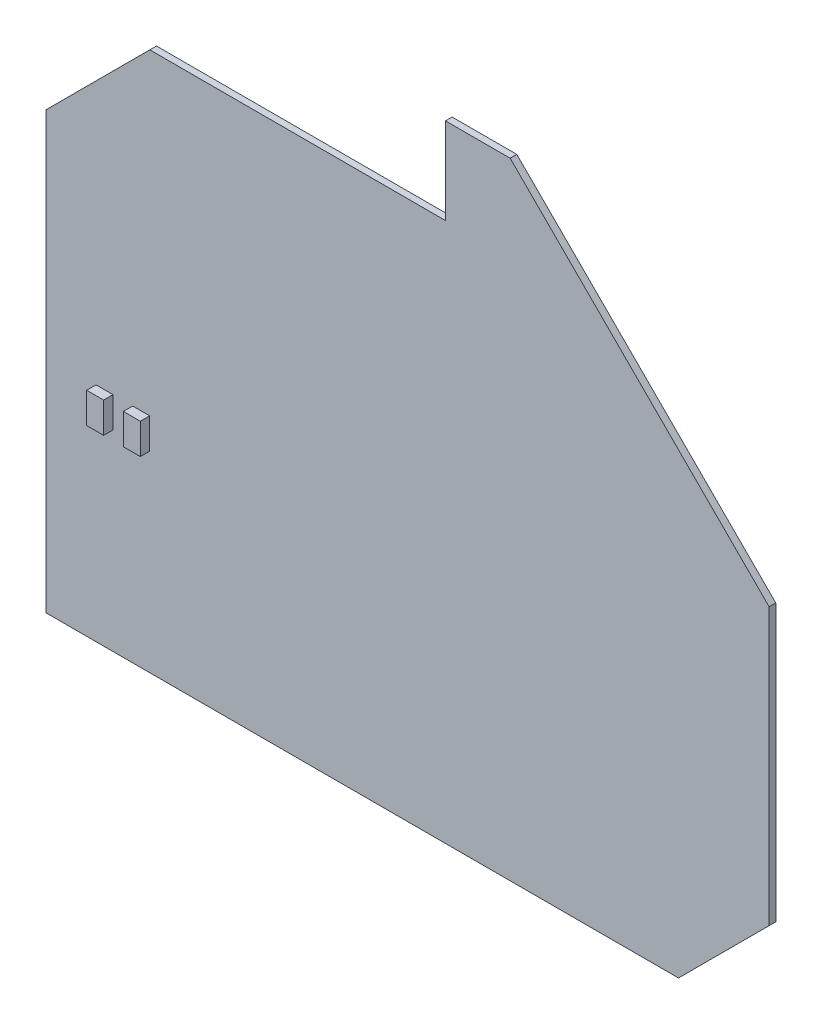
ISO-10303-21;
HEADER;
FILE_DESCRIPTION(('STEP AP214'),'2;1');
FILE_NAME('part.step','',(''),(''),'','','');
FILE_SCHEMA(('AUTOMOTIVE_DESIGN { 1 0 10303 214 1 1 1 1 }'));
ENDSEC;
DATA;
#1=APPLICATION_CONTEXT('core data for automotive mechanical design processes');
#2=APPLICATION_PROTOCOL_DEFINITION('international standard','automotive_design',2000,#1);
#3=PRODUCT_CONTEXT('',#1,'mechanical');
#4=PRODUCT('Part','Part','',(#3));
#5=PRODUCT_RELATED_PRODUCT_CATEGORY('part','',(#4));
#6=PRODUCT_DEFINITION_FORMATION('','',#4);
#7=PRODUCT_DEFINITION_CONTEXT('part definition',#1,'design');
#8=PRODUCT_DEFINITION('design','',#6,#7);
#9=PRODUCT_DEFINITION_SHAPE('','',#8);
#10=(LENGTH_UNIT() NAMED_UNIT(*) SI_UNIT(.MILLI.,.METRE.));
#11=(NAMED_UNIT(*) PLANE_ANGLE_UNIT() SI_UNIT($,.RADIAN.));
#12=(NAMED_UNIT(*) SI_UNIT($,.STERADIAN.) SOLID_ANGLE_UNIT());
#13=UNCERTAINTY_MEASURE_WITH_UNIT(LENGTH_MEASURE(1.E-05),#10,'distance_accuracy_value','');
#14=(GEOMETRIC_REPRESENTATION_CONTEXT(3) GLOBAL_UNCERTAINTY_ASSIGNED_CONTEXT((#13)) GLOBAL_UNIT_ASSIGNED_CONTEXT((#10,
#11,#12)) REPRESENTATION_CONTEXT('',''));
#15=CARTESIAN_POINT('',(0.,0.,0.));
#16=DIRECTION('',(0.,0.,1.));
#17=DIRECTION('',(1.,0.,0.));
#18=AXIS2_PLACEMENT_3D('',#15,#16,#17);
#19=CARTESIAN_POINT('',(58.174,20.712,0.9412));
#20=DIRECTION('',(0.,-1.,0.));
#21=DIRECTION('',(0.,0.,-1.));
#22=AXIS2_PLACEMENT_3D('',#19,#20,#21);
#23=PLANE('',#22);
#24=DIRECTION('',(-1.,0.,0.));
#25=VECTOR('',#24,1.);
#26=CARTESIAN_POINT('',(58.174,20.712,0.3912));
#27=LINE('',#26,#25);
#28=CARTESIAN_POINT('',(59.174,20.712,0.3912));
#29=VERTEX_POINT('',#28);
#30=CARTESIAN_POINT('',(58.174,20.712,0.3912));
#31=VERTEX_POINT('',#30);
#32=EDGE_CURVE('E102',#29,#31,#27,.T.);
#33=ORIENTED_EDGE('',*,*,#32,.T.);
#34=DIRECTION('',(0.,0.,-1.));
#35=VECTOR('',#34,1.);
#36=CARTESIAN_POINT('',(58.174,20.712,0.9412));
#37=LINE('',#36,#35);
#38=CARTESIAN_POINT('',(58.174,20.712,0.9412));
#39=VERTEX_POINT('',#38);
#40=EDGE_CURVE('E56',#39,#31,#37,.T.);
#41=ORIENTED_EDGE('',*,*,#40,.F.);
#42=DIRECTION('',(-1.,0.,0.));
#43=VECTOR('',#42,1.);
#44=CARTESIAN_POINT('',(58.174,20.712,0.9412));
#45=LINE('',#44,#43);
#46=CARTESIAN_POINT('',(59.174,20.712,0.9412));
#47=VERTEX_POINT('',#46);
#48=EDGE_CURVE('E95',#47,#39,#45,.T.);
#49=ORIENTED_EDGE('',*,*,#48,.F.);
#50=DIRECTION('',(0.,0.,-1.));
#51=VECTOR('',#50,1.);
#52=CARTESIAN_POINT('',(59.174,20.712,0.9412));
#53=LINE('',#52,#51);
#54=EDGE_CURVE('E12',#47,#29,#53,.T.);
#55=ORIENTED_EDGE('',*,*,#54,.T.);
#56=EDGE_LOOP('',(#33,#41,#49,#55));
#57=FACE_BOUND('',#56,.T.);
#58=ADVANCED_FACE('F48',(#57),#23,.F.);
#59=CARTESIAN_POINT('',(58.174,18.912,0.9412));
#60=DIRECTION('',(1.,0.,0.));
#61=DIRECTION('',(0.,0.,-1.));
#62=AXIS2_PLACEMENT_3D('',#59,#60,#61);
#63=PLANE('',#62);
#64=DIRECTION('',(0.,-1.,0.));
#65=VECTOR('',#64,1.);
#66=CARTESIAN_POINT('',(58.174,18.912,0.3912));
#67=LINE('',#66,#65);
#68=CARTESIAN_POINT('',(58.174,18.912,0.3912));
#69=VERTEX_POINT('',#68);
#70=EDGE_CURVE('E81',#31,#69,#67,.T.);
#71=ORIENTED_EDGE('',*,*,#70,.T.);
#72=DIRECTION('',(0.,0.,-1.));
#73=VECTOR('',#72,1.);
#74=CARTESIAN_POINT('',(58.174,18.912,0.9412));
#75=LINE('',#74,#73);
#76=CARTESIAN_POINT('',(58.174,18.912,0.9412));
#77=VERTEX_POINT('',#76);
#78=EDGE_CURVE('E103',#77,#69,#75,.T.);
#79=ORIENTED_EDGE('',*,*,#78,.F.);
#80=DIRECTION('',(0.,-1.,0.));
#81=VECTOR('',#80,1.);
#82=CARTESIAN_POINT('',(58.174,20.412,0.9412));
#83=LINE('',#82,#81);
#84=EDGE_CURVE('E99',#39,#77,#83,.T.);
#85=ORIENTED_EDGE('',*,*,#84,.F.);
#86=ORIENTED_EDGE('',*,*,#40,.T.);
#87=EDGE_LOOP('',(#71,#79,#85,#86));
#88=FACE_BOUND('',#87,.T.);
#89=ADVANCED_FACE('F104',(#88),#63,.F.);
#90=CARTESIAN_POINT('',(59.174,18.912,0.9412));
#91=DIRECTION('',(0.,1.,0.));
#92=DIRECTION('',(0.,0.,1.));
#93=AXIS2_PLACEMENT_3D('',#90,#91,#92);
#94=PLANE('',#93);
#95=DIRECTION('',(1.,0.,0.));
#96=VECTOR('',#95,1.);
#97=CARTESIAN_POINT('',(59.174,18.912,0.3912));
#98=LINE('',#97,#96);
#99=CARTESIAN_POINT('',(59.174,18.912,0.3912));
#100=VERTEX_POINT('',#99);
#101=EDGE_CURVE('E114',#69,#100,#98,.T.);
#102=ORIENTED_EDGE('',*,*,#101,.T.);
#103=DIRECTION('',(0.,0.,-1.));
#104=VECTOR('',#103,1.);
#105=CARTESIAN_POINT('',(59.174,18.912,0.9412));
#106=LINE('',#105,#104);
#107=CARTESIAN_POINT('',(59.174,18.912,0.9412));
#108=VERTEX_POINT('',#107);
#109=EDGE_CURVE('E108',#108,#100,#106,.T.);
#110=ORIENTED_EDGE('',*,*,#109,.F.);
#111=DIRECTION('',(1.,0.,0.));
#112=VECTOR('',#111,1.);
#113=CARTESIAN_POINT('',(59.174,18.912,0.9412));
#114=LINE('',#113,#112);
#115=EDGE_CURVE('E106',#77,#108,#114,.T.);
#116=ORIENTED_EDGE('',*,*,#115,.F.);
#117=ORIENTED_EDGE('',*,*,#78,.T.);
#118=EDGE_LOOP('',(#102,#110,#116,#117));
#119=FACE_BOUND('',#118,.T.);
#120=ADVANCED_FACE('F119',(#119),#94,.F.);
#121=CARTESIAN_POINT('',(59.174,20.412,0.9412));
#122=DIRECTION('',(-1.,0.,0.));
#123=DIRECTION('',(0.,0.,1.));
#124=AXIS2_PLACEMENT_3D('',#121,#122,#123);
#125=PLANE('',#124);
#126=DIRECTION('',(0.,1.,0.));
#127=VECTOR('',#126,1.);
#128=CARTESIAN_POINT('',(59.174,20.412,0.3912));
#129=LINE('',#128,#127);
#130=EDGE_CURVE('E88',#100,#29,#129,.T.);
#131=ORIENTED_EDGE('',*,*,#130,.T.);
#132=ORIENTED_EDGE('',*,*,#54,.F.);
#133=DIRECTION('',(0.,1.,0.));
#134=VECTOR('',#133,1.);
#135=CARTESIAN_POINT('',(59.174,20.712,0.9412));
#136=LINE('',#135,#134);
#137=EDGE_CURVE('E64',#108,#47,#136,.T.);
#138=ORIENTED_EDGE('',*,*,#137,.F.);
#139=ORIENTED_EDGE('',*,*,#109,.T.);
#140=EDGE_LOOP('',(#131,#132,#138,#139));
#141=FACE_BOUND('',#140,.T.);
#142=ADVANCED_FACE('F122',(#141),#125,.F.);
#143=CARTESIAN_POINT('',(0.,0.,0.9412));
#144=DIRECTION('',(0.,0.,-1.));
#145=DIRECTION('',(-1.,0.,0.));
#146=AXIS2_PLACEMENT_3D('',#143,#144,#145);
#147=PLANE('',#146);
#148=ORIENTED_EDGE('',*,*,#137,.T.);
#149=ORIENTED_EDGE('',*,*,#48,.T.);
#150=ORIENTED_EDGE('',*,*,#84,.T.);
#151=ORIENTED_EDGE('',*,*,#115,.T.);
#152=EDGE_LOOP('',(#148,#149,#150,#151));
#153=FACE_BOUND('',#152,.T.);
#154=ADVANCED_FACE('F97',(#153),#147,.F.);
#155=CARTESIAN_POINT('',(0.,0.,0.3912));
#156=DIRECTION('',(0.,0.,-1.));
#157=DIRECTION('',(-1.,0.,0.));
#158=AXIS2_PLACEMENT_3D('',#155,#156,#157);
#159=PLANE('',#158);
#160=ORIENTED_EDGE('',*,*,#32,.F.);
#161=ORIENTED_EDGE('',*,*,#130,.F.);
#162=ORIENTED_EDGE('',*,*,#101,.F.);
#163=ORIENTED_EDGE('',*,*,#70,.F.);
#164=EDGE_LOOP('',(#160,#161,#162,#163));
#165=FACE_BOUND('',#164,.T.);
#166=ADVANCED_FACE('F121',(#165),#159,.T.);
#167=CLOSED_SHELL('',(#58,#89,#120,#142,#154,#166));
#168=MANIFOLD_SOLID_BREP('B2',#167);
#169=CARTESIAN_POINT('',(60.333,20.712,0.9412));
#170=DIRECTION('',(0.,-1.,0.));
#171=DIRECTION('',(0.,0.,-1.));
#172=AXIS2_PLACEMENT_3D('',#169,#170,#171);
#173=PLANE('',#172);
#174=DIRECTION('',(-1.,0.,0.));
#175=VECTOR('',#174,1.);
#176=CARTESIAN_POINT('',(60.333,20.712,0.3912));
#177=LINE('',#176,#175);
#178=CARTESIAN_POINT('',(61.333,20.712,0.3912));
#179=VERTEX_POINT('',#178);
#180=CARTESIAN_POINT('',(60.333,20.712,0.3912));
#181=VERTEX_POINT('',#180);
#182=EDGE_CURVE('E247',#179,#181,#177,.T.);
#183=ORIENTED_EDGE('',*,*,#182,.T.);
#184=DIRECTION('',(0.,0.,-1.));
#185=VECTOR('',#184,1.);
#186=CARTESIAN_POINT('',(60.333,20.712,0.9412));
#187=LINE('',#186,#185);
#188=CARTESIAN_POINT('',(60.333,20.712,0.9412));
#189=VERTEX_POINT('',#188);
#190=EDGE_CURVE('E201',#189,#181,#187,.T.);
#191=ORIENTED_EDGE('',*,*,#190,.F.);
#192=DIRECTION('',(-1.,0.,0.));
#193=VECTOR('',#192,1.);
#194=CARTESIAN_POINT('',(60.333,20.712,0.9412));
#195=LINE('',#194,#193);
#196=CARTESIAN_POINT('',(61.333,20.712,0.9412));
#197=VERTEX_POINT('',#196);
#198=EDGE_CURVE('E240',#197,#189,#195,.T.);
#199=ORIENTED_EDGE('',*,*,#198,.F.);
#200=DIRECTION('',(0.,0.,-1.));
#201=VECTOR('',#200,1.);
#202=CARTESIAN_POINT('',(61.333,20.712,0.9412));
#203=LINE('',#202,#201);
#204=EDGE_CURVE('E46',#197,#179,#203,.T.);
#205=ORIENTED_EDGE('',*,*,#204,.T.);
#206=EDGE_LOOP('',(#183,#191,#199,#205));
#207=FACE_BOUND('',#206,.T.);
#208=ADVANCED_FACE('F193',(#207),#173,.F.);
#209=CARTESIAN_POINT('',(60.333,18.912,0.9412));
#210=DIRECTION('',(1.,0.,0.));
#211=DIRECTION('',(0.,0.,-1.));
#212=AXIS2_PLACEMENT_3D('',#209,#210,#211);
#213=PLANE('',#212);
#214=DIRECTION('',(0.,-1.,0.));
#215=VECTOR('',#214,1.);
#216=CARTESIAN_POINT('',(60.333,18.912,0.3912));
#217=LINE('',#216,#215);
#218=CARTESIAN_POINT('',(60.333,18.912,0.3912));
#219=VERTEX_POINT('',#218);
#220=EDGE_CURVE('E226',#181,#219,#217,.T.);
#221=ORIENTED_EDGE('',*,*,#220,.T.);
#222=DIRECTION('',(0.,0.,-1.));
#223=VECTOR('',#222,1.);
#224=CARTESIAN_POINT('',(60.333,18.912,0.9412));
#225=LINE('',#224,#223);
#226=CARTESIAN_POINT('',(60.333,18.912,0.9412));
#227=VERTEX_POINT('',#226);
#228=EDGE_CURVE('E248',#227,#219,#225,.T.);
#229=ORIENTED_EDGE('',*,*,#228,.F.);
#230=DIRECTION('',(0.,-1.,0.));
#231=VECTOR('',#230,1.);
#232=CARTESIAN_POINT('',(60.333,20.412,0.9412));
#233=LINE('',#232,#231);
#234=EDGE_CURVE('E244',#189,#227,#233,.T.);
#235=ORIENTED_EDGE('',*,*,#234,.F.);
#236=ORIENTED_EDGE('',*,*,#190,.T.);
#237=EDGE_LOOP('',(#221,#229,#235,#236));
#238=FACE_BOUND('',#237,.T.);
#239=ADVANCED_FACE('F249',(#238),#213,.F.);
#240=CARTESIAN_POINT('',(61.333,18.912,0.9412));
#241=DIRECTION('',(0.,1.,0.));
#242=DIRECTION('',(0.,0.,1.));
#243=AXIS2_PLACEMENT_3D('',#240,#241,#242);
#244=PLANE('',#243);
#245=DIRECTION('',(1.,0.,0.));
#246=VECTOR('',#245,1.);
#247=CARTESIAN_POINT('',(61.333,18.912,0.3912));
#248=LINE('',#247,#246);
#249=CARTESIAN_POINT('',(61.333,18.912,0.3912));
#250=VERTEX_POINT('',#249);
#251=EDGE_CURVE('E259',#219,#250,#248,.T.);
#252=ORIENTED_EDGE('',*,*,#251,.T.);
#253=DIRECTION('',(0.,0.,-1.));
#254=VECTOR('',#253,1.);
#255=CARTESIAN_POINT('',(61.333,18.912,0.9412));
#256=LINE('',#255,#254);
#257=CARTESIAN_POINT('',(61.333,18.912,0.9412));
#258=VERTEX_POINT('',#257);
#259=EDGE_CURVE('E253',#258,#250,#256,.T.);
#260=ORIENTED_EDGE('',*,*,#259,.F.);
#261=DIRECTION('',(1.,0.,0.));
#262=VECTOR('',#261,1.);
#263=CARTESIAN_POINT('',(61.333,18.912,0.9412));
#264=LINE('',#263,#262);
#265=EDGE_CURVE('E251',#227,#258,#264,.T.);
#266=ORIENTED_EDGE('',*,*,#265,.F.);
#267=ORIENTED_EDGE('',*,*,#228,.T.);
#268=EDGE_LOOP('',(#252,#260,#266,#267));
#269=FACE_BOUND('',#268,.T.);
#270=ADVANCED_FACE('F264',(#269),#244,.F.);
#271=CARTESIAN_POINT('',(61.333,20.412,0.9412));
#272=DIRECTION('',(-1.,0.,0.));
#273=DIRECTION('',(0.,0.,1.));
#274=AXIS2_PLACEMENT_3D('',#271,#272,#273);
#275=PLANE('',#274);
#276=DIRECTION('',(0.,1.,0.));
#277=VECTOR('',#276,1.);
#278=CARTESIAN_POINT('',(61.333,20.412,0.3912));
#279=LINE('',#278,#277);
#280=EDGE_CURVE('E233',#250,#179,#279,.T.);
#281=ORIENTED_EDGE('',*,*,#280,.T.);
#282=ORIENTED_EDGE('',*,*,#204,.F.);
#283=DIRECTION('',(0.,1.,0.));
#284=VECTOR('',#283,1.);
#285=CARTESIAN_POINT('',(61.333,20.712,0.9412));
#286=LINE('',#285,#284);
#287=EDGE_CURVE('E209',#258,#197,#286,.T.);
#288=ORIENTED_EDGE('',*,*,#287,.F.);
#289=ORIENTED_EDGE('',*,*,#259,.T.);
#290=EDGE_LOOP('',(#281,#282,#288,#289));
#291=FACE_BOUND('',#290,.T.);
#292=ADVANCED_FACE('F267',(#291),#275,.F.);
#293=CARTESIAN_POINT('',(0.,0.,0.9412));
#294=DIRECTION('',(0.,0.,-1.));
#295=DIRECTION('',(-1.,0.,0.));
#296=AXIS2_PLACEMENT_3D('',#293,#294,#295);
#297=PLANE('',#296);
#298=ORIENTED_EDGE('',*,*,#287,.T.);
#299=ORIENTED_EDGE('',*,*,#198,.T.);
#300=ORIENTED_EDGE('',*,*,#234,.T.);
#301=ORIENTED_EDGE('',*,*,#265,.T.);
#302=EDGE_LOOP('',(#298,#299,#300,#301));
#303=FACE_BOUND('',#302,.T.);
#304=ADVANCED_FACE('F242',(#303),#297,.F.);
#305=CARTESIAN_POINT('',(0.,0.,0.3912));
#306=DIRECTION('',(0.,0.,-1.));
#307=DIRECTION('',(-1.,0.,0.));
#308=AXIS2_PLACEMENT_3D('',#305,#306,#307);
#309=PLANE('',#308);
#310=ORIENTED_EDGE('',*,*,#182,.F.);
#311=ORIENTED_EDGE('',*,*,#280,.F.);
#312=ORIENTED_EDGE('',*,*,#251,.F.);
#313=ORIENTED_EDGE('',*,*,#220,.F.);
#314=EDGE_LOOP('',(#310,#311,#312,#313));
#315=FACE_BOUND('',#314,.T.);
#316=ADVANCED_FACE('F266',(#315),#309,.T.);
#317=CLOSED_SHELL('',(#208,#239,#270,#292,#304,#316));
#318=MANIFOLD_SOLID_BREP('B6',#317);
#319=CARTESIAN_POINT('',(92.456,7.62,0.3912));
#320=DIRECTION('',(0.,1.,0.));
#321=DIRECTION('',(0.,0.,1.));
#322=AXIS2_PLACEMENT_3D('',#319,#320,#321);
#323=PLANE('',#322);
#324=DIRECTION('',(1.,0.,0.));
#325=VECTOR('',#324,1.);
#326=CARTESIAN_POINT('',(92.456,7.62,0.));
#327=LINE('',#326,#325);
#328=CARTESIAN_POINT('',(55.245,7.62,0.));
#329=VERTEX_POINT('',#328);
#330=CARTESIAN_POINT('',(92.456,7.62,0.));
#331=VERTEX_POINT('',#330);
#332=EDGE_CURVE('E431',#329,#331,#327,.T.);
#333=ORIENTED_EDGE('',*,*,#332,.T.);
#334=DIRECTION('',(0.,0.,-1.));
#335=VECTOR('',#334,1.);
#336=CARTESIAN_POINT('',(92.456,7.62,0.3912));
#337=LINE('',#336,#335);
#338=CARTESIAN_POINT('',(92.456,7.62,0.3912));
#339=VERTEX_POINT('',#338);
#340=EDGE_CURVE('E191',#339,#331,#337,.T.);
#341=ORIENTED_EDGE('',*,*,#340,.F.);
#342=DIRECTION('',(1.,0.,0.));
#343=VECTOR('',#342,1.);
#344=CARTESIAN_POINT('',(92.456,7.62,0.3912));
#345=LINE('',#344,#343);
#346=CARTESIAN_POINT('',(55.245,7.62,0.3912));
#347=VERTEX_POINT('',#346);
#348=EDGE_CURVE('E447',#347,#339,#345,.T.);
#349=ORIENTED_EDGE('',*,*,#348,.F.);
#350=DIRECTION('',(0.,0.,-1.));
#351=VECTOR('',#350,1.);
#352=CARTESIAN_POINT('',(55.245,7.62,0.3912));
#353=LINE('',#352,#351);
#354=EDGE_CURVE('E427',#347,#329,#353,.T.);
#355=ORIENTED_EDGE('',*,*,#354,.T.);
#356=EDGE_LOOP('',(#333,#341,#349,#355));
#357=FACE_BOUND('',#356,.T.);
#358=ADVANCED_FACE('F329',(#357),#323,.F.);
#359=CARTESIAN_POINT('',(97.79,12.954,0.3912));
#360=DIRECTION('',(-0.707106781186547,0.707106781186548,0.));
#361=DIRECTION('',(-0.707106781186548,-0.707106781186547,0.));
#362=AXIS2_PLACEMENT_3D('',#359,#360,#361);
#363=PLANE('',#362);
#364=DIRECTION('',(0.707106781186548,0.707106781186547,0.));
#365=VECTOR('',#364,1.);
#366=CARTESIAN_POINT('',(97.79,12.954,0.));
#367=LINE('',#366,#365);
#368=CARTESIAN_POINT('',(97.79,12.954,0.));
#369=VERTEX_POINT('',#368);
#370=EDGE_CURVE('E434',#331,#369,#367,.T.);
#371=ORIENTED_EDGE('',*,*,#370,.T.);
#372=DIRECTION('',(0.,0.,-1.));
#373=VECTOR('',#372,1.);
#374=CARTESIAN_POINT('',(97.79,12.954,0.3912));
#375=LINE('',#374,#373);
#376=CARTESIAN_POINT('',(97.79,12.954,0.3912));
#377=VERTEX_POINT('',#376);
#378=EDGE_CURVE('E337',#377,#369,#375,.T.);
#379=ORIENTED_EDGE('',*,*,#378,.F.);
#380=DIRECTION('',(0.707106781186548,0.707106781186547,0.));
#381=VECTOR('',#380,1.);
#382=CARTESIAN_POINT('',(97.79,12.954,0.3912));
#383=LINE('',#382,#381);
#384=EDGE_CURVE('E391',#339,#377,#383,.T.);
#385=ORIENTED_EDGE('',*,*,#384,.F.);
#386=ORIENTED_EDGE('',*,*,#340,.T.);
#387=EDGE_LOOP('',(#371,#379,#385,#386));
#388=FACE_BOUND('',#387,.T.);
#389=ADVANCED_FACE('F490',(#388),#363,.F.);
#390=CARTESIAN_POINT('',(97.79,29.21,0.3912));
#391=DIRECTION('',(-1.,0.,0.));
#392=DIRECTION('',(0.,0.,1.));
#393=AXIS2_PLACEMENT_3D('',#390,#391,#392);
#394=PLANE('',#393);
#395=DIRECTION('',(0.,1.,0.));
#396=VECTOR('',#395,1.);
#397=CARTESIAN_POINT('',(97.79,29.21,0.));
#398=LINE('',#397,#396);
#399=CARTESIAN_POINT('',(97.79,29.21,0.));
#400=VERTEX_POINT('',#399);
#401=EDGE_CURVE('E436',#369,#400,#398,.T.);
#402=ORIENTED_EDGE('',*,*,#401,.T.);
#403=DIRECTION('',(0.,0.,-1.));
#404=VECTOR('',#403,1.);
#405=CARTESIAN_POINT('',(97.79,29.21,0.3912));
#406=LINE('',#405,#404);
#407=CARTESIAN_POINT('',(97.79,29.21,0.3912));
#408=VERTEX_POINT('',#407);
#409=EDGE_CURVE('E457',#408,#400,#406,.T.);
#410=ORIENTED_EDGE('',*,*,#409,.F.);
#411=DIRECTION('',(0.,1.,0.));
#412=VECTOR('',#411,1.);
#413=CARTESIAN_POINT('',(97.79,29.21,0.3912));
#414=LINE('',#413,#412);
#415=EDGE_CURVE('E465',#377,#408,#414,.T.);
#416=ORIENTED_EDGE('',*,*,#415,.F.);
#417=ORIENTED_EDGE('',*,*,#378,.T.);
#418=EDGE_LOOP('',(#402,#410,#416,#417));
#419=FACE_BOUND('',#418,.T.);
#420=ADVANCED_FACE('F463',(#419),#394,.F.);
#421=CARTESIAN_POINT('',(82.55,44.45,0.3912));
#422=DIRECTION('',(-0.707106781186548,-0.707106781186548,0.));
#423=DIRECTION('',(0.707106781186548,-0.707106781186548,0.));
#424=AXIS2_PLACEMENT_3D('',#421,#422,#423);
#425=PLANE('',#424);
#426=DIRECTION('',(-0.707106781186547,0.707106781186547,0.));
#427=VECTOR('',#426,1.);
#428=CARTESIAN_POINT('',(82.55,44.45,0.));
#429=LINE('',#428,#427);
#430=CARTESIAN_POINT('',(82.55,44.45,0.));
#431=VERTEX_POINT('',#430);
#432=EDGE_CURVE('E438',#400,#431,#429,.T.);
#433=ORIENTED_EDGE('',*,*,#432,.T.);
#434=DIRECTION('',(0.,0.,-1.));
#435=VECTOR('',#434,1.);
#436=CARTESIAN_POINT('',(82.55,44.45,0.3912));
#437=LINE('',#436,#435);
#438=CARTESIAN_POINT('',(82.55,44.45,0.3912));
#439=VERTEX_POINT('',#438);
#440=EDGE_CURVE('E454',#439,#431,#437,.T.);
#441=ORIENTED_EDGE('',*,*,#440,.F.);
#442=DIRECTION('',(-0.707106781186547,0.707106781186547,0.));
#443=VECTOR('',#442,1.);
#444=CARTESIAN_POINT('',(82.55,44.45,0.3912));
#445=LINE('',#444,#443);
#446=EDGE_CURVE('E481',#408,#439,#445,.T.);
#447=ORIENTED_EDGE('',*,*,#446,.F.);
#448=ORIENTED_EDGE('',*,*,#409,.T.);
#449=EDGE_LOOP('',(#433,#441,#447,#448));
#450=FACE_BOUND('',#449,.T.);
#451=ADVANCED_FACE('F474',(#450),#425,.F.);
#452=CARTESIAN_POINT('',(78.74,44.45,0.3912));
#453=DIRECTION('',(0.,-1.,0.));
#454=DIRECTION('',(0.,0.,-1.));
#455=AXIS2_PLACEMENT_3D('',#452,#453,#454);
#456=PLANE('',#455);
#457=DIRECTION('',(-1.,0.,0.));
#458=VECTOR('',#457,1.);
#459=CARTESIAN_POINT('',(78.74,44.45,0.));
#460=LINE('',#459,#458);
#461=CARTESIAN_POINT('',(78.74,44.45,0.));
#462=VERTEX_POINT('',#461);
#463=EDGE_CURVE('E440',#431,#462,#460,.T.);
#464=ORIENTED_EDGE('',*,*,#463,.T.);
#465=DIRECTION('',(0.,0.,-1.));
#466=VECTOR('',#465,1.);
#467=CARTESIAN_POINT('',(78.74,44.45,0.3912));
#468=LINE('',#467,#466);
#469=CARTESIAN_POINT('',(78.74,44.45,0.3912));
#470=VERTEX_POINT('',#469);
#471=EDGE_CURVE('E451',#470,#462,#468,.T.);
#472=ORIENTED_EDGE('',*,*,#471,.F.);
#473=DIRECTION('',(-1.,0.,0.));
#474=VECTOR('',#473,1.);
#475=CARTESIAN_POINT('',(78.74,44.45,0.3912));
#476=LINE('',#475,#474);
#477=EDGE_CURVE('E480',#439,#470,#476,.T.);
#478=ORIENTED_EDGE('',*,*,#477,.F.);
#479=ORIENTED_EDGE('',*,*,#440,.T.);
#480=EDGE_LOOP('',(#464,#472,#478,#479));
#481=FACE_BOUND('',#480,.T.);
#482=ADVANCED_FACE('F478',(#481),#456,.F.);
#483=CARTESIAN_POINT('',(78.74,39.37,0.3912));
#484=DIRECTION('',(1.,0.,0.));
#485=DIRECTION('',(0.,0.,-1.));
#486=AXIS2_PLACEMENT_3D('',#483,#484,#485);
#487=PLANE('',#486);
#488=DIRECTION('',(0.,-1.,0.));
#489=VECTOR('',#488,1.);
#490=CARTESIAN_POINT('',(78.74,39.37,0.));
#491=LINE('',#490,#489);
#492=CARTESIAN_POINT('',(78.74,39.37,0.));
#493=VERTEX_POINT('',#492);
#494=EDGE_CURVE('E442',#462,#493,#491,.T.);
#495=ORIENTED_EDGE('',*,*,#494,.T.);
#496=DIRECTION('',(0.,0.,-1.));
#497=VECTOR('',#496,1.);
#498=CARTESIAN_POINT('',(78.74,39.37,0.3912));
#499=LINE('',#498,#497);
#500=CARTESIAN_POINT('',(78.74,39.37,0.3912));
#501=VERTEX_POINT('',#500);
#502=EDGE_CURVE('E422',#501,#493,#499,.T.);
#503=ORIENTED_EDGE('',*,*,#502,.F.);
#504=DIRECTION('',(0.,-1.,0.));
#505=VECTOR('',#504,1.);
#506=CARTESIAN_POINT('',(78.74,39.37,0.3912));
#507=LINE('',#506,#505);
#508=EDGE_CURVE('E413',#470,#501,#507,.T.);
#509=ORIENTED_EDGE('',*,*,#508,.F.);
#510=ORIENTED_EDGE('',*,*,#471,.T.);
#511=EDGE_LOOP('',(#495,#503,#509,#510));
#512=FACE_BOUND('',#511,.T.);
#513=ADVANCED_FACE('F502',(#512),#487,.F.);
#514=CARTESIAN_POINT('',(61.341,39.37,0.3912));
#515=DIRECTION('',(0.,-1.,0.));
#516=DIRECTION('',(0.,0.,-1.));
#517=AXIS2_PLACEMENT_3D('',#514,#515,#516);
#518=PLANE('',#517);
#519=DIRECTION('',(-1.,0.,0.));
#520=VECTOR('',#519,1.);
#521=CARTESIAN_POINT('',(61.341,39.37,0.));
#522=LINE('',#521,#520);
#523=CARTESIAN_POINT('',(61.341,39.37,0.));
#524=VERTEX_POINT('',#523);
#525=EDGE_CURVE('E421',#493,#524,#522,.T.);
#526=ORIENTED_EDGE('',*,*,#525,.T.);
#527=DIRECTION('',(0.,0.,-1.));
#528=VECTOR('',#527,1.);
#529=CARTESIAN_POINT('',(61.341,39.37,0.3912));
#530=LINE('',#529,#528);
#531=CARTESIAN_POINT('',(61.341,39.37,0.3912));
#532=VERTEX_POINT('',#531);
#533=EDGE_CURVE('E418',#532,#524,#530,.T.);
#534=ORIENTED_EDGE('',*,*,#533,.F.);
#535=DIRECTION('',(-1.,0.,0.));
#536=VECTOR('',#535,1.);
#537=CARTESIAN_POINT('',(61.341,39.37,0.3912));
#538=LINE('',#537,#536);
#539=EDGE_CURVE('E407',#501,#532,#538,.T.);
#540=ORIENTED_EDGE('',*,*,#539,.F.);
#541=ORIENTED_EDGE('',*,*,#502,.T.);
#542=EDGE_LOOP('',(#526,#534,#540,#541));
#543=FACE_BOUND('',#542,.T.);
#544=ADVANCED_FACE('F419',(#543),#518,.F.);
#545=CARTESIAN_POINT('',(55.245,33.274,0.3912));
#546=DIRECTION('',(0.707106781186547,-0.707106781186548,0.));
#547=DIRECTION('',(0.707106781186548,0.707106781186547,0.));
#548=AXIS2_PLACEMENT_3D('',#545,#546,#547);
#549=PLANE('',#548);
#550=DIRECTION('',(-0.707106781186548,-0.707106781186547,0.));
#551=VECTOR('',#550,1.);
#552=CARTESIAN_POINT('',(55.245,33.274,0.));
#553=LINE('',#552,#551);
#554=CARTESIAN_POINT('',(55.245,33.274,0.));
#555=VERTEX_POINT('',#554);
#556=EDGE_CURVE('E377',#524,#555,#553,.T.);
#557=ORIENTED_EDGE('',*,*,#556,.T.);
#558=DIRECTION('',(0.,0.,-1.));
#559=VECTOR('',#558,1.);
#560=CARTESIAN_POINT('',(55.245,33.274,0.3912));
#561=LINE('',#560,#559);
#562=CARTESIAN_POINT('',(55.245,33.274,0.3912));
#563=VERTEX_POINT('',#562);
#564=EDGE_CURVE('E423',#563,#555,#561,.T.);
#565=ORIENTED_EDGE('',*,*,#564,.F.);
#566=DIRECTION('',(-0.707106781186548,-0.707106781186547,0.));
#567=VECTOR('',#566,1.);
#568=CARTESIAN_POINT('',(55.245,33.274,0.3912));
#569=LINE('',#568,#567);
#570=EDGE_CURVE('E411',#532,#563,#569,.T.);
#571=ORIENTED_EDGE('',*,*,#570,.F.);
#572=ORIENTED_EDGE('',*,*,#533,.T.);
#573=EDGE_LOOP('',(#557,#565,#571,#572));
#574=FACE_BOUND('',#573,.T.);
#575=ADVANCED_FACE('F425',(#574),#549,.F.);
#576=CARTESIAN_POINT('',(55.245,7.62,0.3912));
#577=DIRECTION('',(1.,0.,0.));
#578=DIRECTION('',(0.,0.,-1.));
#579=AXIS2_PLACEMENT_3D('',#576,#577,#578);
#580=PLANE('',#579);
#581=DIRECTION('',(0.,-1.,0.));
#582=VECTOR('',#581,1.);
#583=CARTESIAN_POINT('',(55.245,7.62,0.));
#584=LINE('',#583,#582);
#585=EDGE_CURVE('E383',#555,#329,#584,.T.);
#586=ORIENTED_EDGE('',*,*,#585,.T.);
#587=ORIENTED_EDGE('',*,*,#354,.F.);
#588=DIRECTION('',(0.,-1.,0.));
#589=VECTOR('',#588,1.);
#590=CARTESIAN_POINT('',(55.245,7.62,0.3912));
#591=LINE('',#590,#589);
#592=EDGE_CURVE('E345',#563,#347,#591,.T.);
#593=ORIENTED_EDGE('',*,*,#592,.F.);
#594=ORIENTED_EDGE('',*,*,#564,.T.);
#595=EDGE_LOOP('',(#586,#587,#593,#594));
#596=FACE_BOUND('',#595,.T.);
#597=ADVANCED_FACE('F510',(#596),#580,.F.);
#598=CARTESIAN_POINT('',(0.,0.,0.3912));
#599=DIRECTION('',(0.,0.,-1.));
#600=DIRECTION('',(-1.,0.,0.));
#601=AXIS2_PLACEMENT_3D('',#598,#599,#600);
#602=PLANE('',#601);
#603=ORIENTED_EDGE('',*,*,#348,.T.);
#604=ORIENTED_EDGE('',*,*,#384,.T.);
#605=ORIENTED_EDGE('',*,*,#415,.T.);
#606=ORIENTED_EDGE('',*,*,#446,.T.);
#607=ORIENTED_EDGE('',*,*,#477,.T.);
#608=ORIENTED_EDGE('',*,*,#508,.T.);
#609=ORIENTED_EDGE('',*,*,#539,.T.);
#610=ORIENTED_EDGE('',*,*,#570,.T.);
#611=ORIENTED_EDGE('',*,*,#592,.T.);
#612=EDGE_LOOP('',(#603,#604,#605,#606,#607,#608,#609,#610,#611));
#613=FACE_BOUND('',#612,.T.);
#614=ADVANCED_FACE('F409',(#613),#602,.F.);
#615=CARTESIAN_POINT('',(0.,0.,0.));
#616=DIRECTION('',(0.,0.,-1.));
#617=DIRECTION('',(-1.,0.,0.));
#618=AXIS2_PLACEMENT_3D('',#615,#616,#617);
#619=PLANE('',#618);
#620=ORIENTED_EDGE('',*,*,#332,.F.);
#621=ORIENTED_EDGE('',*,*,#585,.F.);
#622=ORIENTED_EDGE('',*,*,#556,.F.);
#623=ORIENTED_EDGE('',*,*,#525,.F.);
#624=ORIENTED_EDGE('',*,*,#494,.F.);
#625=ORIENTED_EDGE('',*,*,#463,.F.);
#626=ORIENTED_EDGE('',*,*,#432,.F.);
#627=ORIENTED_EDGE('',*,*,#401,.F.);
#628=ORIENTED_EDGE('',*,*,#370,.F.);
#629=EDGE_LOOP('',(#620,#621,#622,#623,#624,#625,#626,#627,#628));
#630=FACE_BOUND('',#629,.T.);
#631=ADVANCED_FACE('F469',(#630),#619,.T.);
#632=CLOSED_SHELL('',(#358,#389,#420,#451,#482,#513,#544,#575,#597,#614,#631));
#633=MANIFOLD_SOLID_BREP('B40',#632);
#634=ADVANCED_BREP_SHAPE_REPRESENTATION('',(#18,#168,#318,#633),#14);
#635=SHAPE_DEFINITION_REPRESENTATION(#9,#634);
ENDSEC;
END-ISO-10303-21;
